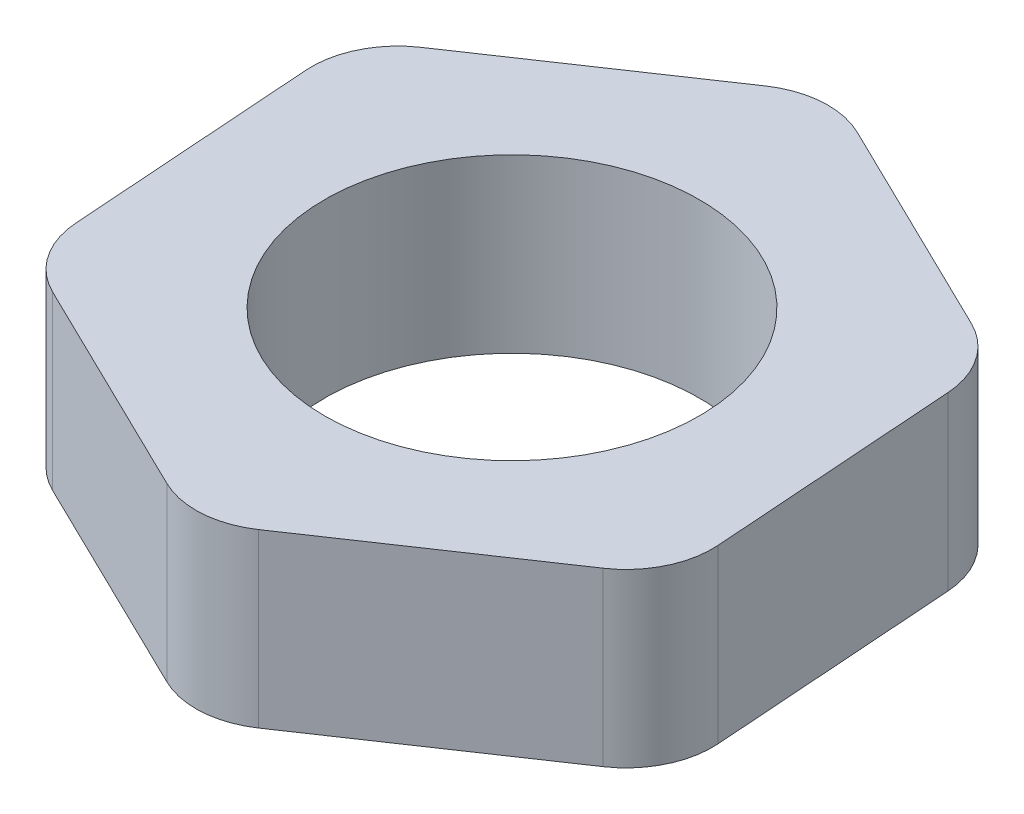
ISO-10303-21;
HEADER;
FILE_DESCRIPTION(('STEP AP214'),'2;1');
FILE_NAME('part.step','',(''),(''),'','','');
FILE_SCHEMA(('AUTOMOTIVE_DESIGN { 1 0 10303 214 1 1 1 1 }'));
ENDSEC;
DATA;
#1=APPLICATION_CONTEXT('core data for automotive mechanical design processes');
#2=APPLICATION_PROTOCOL_DEFINITION('international standard','automotive_design',2000,#1);
#3=PRODUCT_CONTEXT('',#1,'mechanical');
#4=PRODUCT('Part','Part','',(#3));
#5=PRODUCT_RELATED_PRODUCT_CATEGORY('part','',(#4));
#6=PRODUCT_DEFINITION_FORMATION('','',#4);
#7=PRODUCT_DEFINITION_CONTEXT('part definition',#1,'design');
#8=PRODUCT_DEFINITION('design','',#6,#7);
#9=PRODUCT_DEFINITION_SHAPE('','',#8);
#10=(LENGTH_UNIT() NAMED_UNIT(*) SI_UNIT(.MILLI.,.METRE.));
#11=(NAMED_UNIT(*) PLANE_ANGLE_UNIT() SI_UNIT($,.RADIAN.));
#12=(NAMED_UNIT(*) SI_UNIT($,.STERADIAN.) SOLID_ANGLE_UNIT());
#13=UNCERTAINTY_MEASURE_WITH_UNIT(LENGTH_MEASURE(1.E-05),#10,'distance_accuracy_value','');
#14=(GEOMETRIC_REPRESENTATION_CONTEXT(3) GLOBAL_UNCERTAINTY_ASSIGNED_CONTEXT((#13)) GLOBAL_UNIT_ASSIGNED_CONTEXT((#10,
#11,#12)) REPRESENTATION_CONTEXT('',''));
#15=CARTESIAN_POINT('',(0.,0.,0.));
#16=DIRECTION('',(0.,0.,1.));
#17=DIRECTION('',(1.,0.,0.));
#18=AXIS2_PLACEMENT_3D('',#15,#16,#17);
#19=CARTESIAN_POINT('',(0.,1.,0.));
#20=DIRECTION('',(0.,1.,0.));
#21=DIRECTION('',(0.,0.,1.));
#22=AXIS2_PLACEMENT_3D('',#19,#20,#21);
#23=PLANE('',#22);
#24=DIRECTION('',(-0.898893991680832,0.,-0.438166169072991));
#25=VECTOR('',#24,1.);
#26=CARTESIAN_POINT('',(1.675,1.,-1.13035761302932));
#27=LINE('',#26,#25);
#28=CARTESIAN_POINT('',(1.41551165596507,1.,-1.25684529086136));
#29=VERTEX_POINT('',#28);
#30=CARTESIAN_POINT('',(0.118069935790403,1.,-1.88928368002155));
#31=VERTEX_POINT('',#30);
#32=EDGE_CURVE('E168',#29,#31,#27,.T.);
#33=ORIENTED_EDGE('',*,*,#32,.T.);
#34=CARTESIAN_POINT('',(-0.101013148746093,1.,-1.43983668418114));
#35=DIRECTION('',(0.,1.,0.));
#36=DIRECTION('',(0.,0.,1.));
#37=AXIS2_PLACEMENT_3D('',#34,#35,#36);
#38=CIRCLE('',#37,0.5);
#39=CARTESIAN_POINT('',(-0.380704122530244,1.,-1.85429169884941));
#40=VERTEX_POINT('',#39);
#41=EDGE_CURVE('E191',#31,#40,#38,.T.);
#42=ORIENTED_EDGE('',*,*,#41,.T.);
#43=DIRECTION('',(-0.828910029336534,0.,0.559381947568303));
#44=VECTOR('',#43,1.);
#45=CARTESIAN_POINT('',(-0.14141840824453,1.,-2.01577135785359));
#46=LINE('',#45,#44);
#47=CARTESIAN_POINT('',(-1.57713269395882,1.,-1.04689340382846));
#48=VERTEX_POINT('',#47);
#49=EDGE_CURVE('E144',#40,#48,#46,.T.);
#50=ORIENTED_EDGE('',*,*,#49,.T.);
#51=CARTESIAN_POINT('',(-1.29744172017466,1.,-0.632438389160197));
#52=DIRECTION('',(0.,1.,0.));
#53=DIRECTION('',(0.,0.,1.));
#54=AXIS2_PLACEMENT_3D('',#51,#52,#53);
#55=CIRCLE('',#54,0.5);
#56=CARTESIAN_POINT('',(-1.79621577849531,1.,-0.597446407988047));
#57=VERTEX_POINT('',#56);
#58=EDGE_CURVE('E189',#48,#57,#55,.T.);
#59=ORIENTED_EDGE('',*,*,#58,.T.);
#60=DIRECTION('',(0.0699839623442985,0.,0.997548116641294));
#61=VECTOR('',#60,1.);
#62=CARTESIAN_POINT('',(-1.81641840824453,1.,-0.885413744824275));
#63=LINE('',#62,#61);
#64=CARTESIAN_POINT('',(-1.69520262974922,1.,0.842390276193091));
#65=VERTEX_POINT('',#64);
#66=EDGE_CURVE('E228',#57,#65,#63,.T.);
#67=ORIENTED_EDGE('',*,*,#66,.T.);
#68=CARTESIAN_POINT('',(-1.19642857142857,1.,0.807398295020942));
#69=DIRECTION('',(0.,1.,0.));
#70=DIRECTION('',(0.,0.,1.));
#71=AXIS2_PLACEMENT_3D('',#68,#69,#70);
#72=CIRCLE('',#71,0.5);
#73=CARTESIAN_POINT('',(-1.41551165596507,1.,1.25684529086136));
#74=VERTEX_POINT('',#73);
#75=EDGE_CURVE('E187',#65,#74,#72,.T.);
#76=ORIENTED_EDGE('',*,*,#75,.T.);
#77=DIRECTION('',(0.898893991680832,0.,0.438166169072991));
#78=VECTOR('',#77,1.);
#79=CARTESIAN_POINT('',(-1.675,1.,1.13035761302932));
#80=LINE('',#79,#78);
#81=CARTESIAN_POINT('',(-0.118069935790403,1.,1.88928368002155));
#82=VERTEX_POINT('',#81);
#83=EDGE_CURVE('E223',#74,#82,#80,.T.);
#84=ORIENTED_EDGE('',*,*,#83,.T.);
#85=CARTESIAN_POINT('',(0.101013148746093,1.,1.43983668418114));
#86=DIRECTION('',(0.,1.,0.));
#87=DIRECTION('',(0.,0.,1.));
#88=AXIS2_PLACEMENT_3D('',#85,#86,#87);
#89=CIRCLE('',#88,0.5);
#90=CARTESIAN_POINT('',(0.380704122530244,1.,1.8542916988494));
#91=VERTEX_POINT('',#90);
#92=EDGE_CURVE('E185',#82,#91,#89,.T.);
#93=ORIENTED_EDGE('',*,*,#92,.T.);
#94=DIRECTION('',(0.828910029336534,0.,-0.559381947568303));
#95=VECTOR('',#94,1.);
#96=CARTESIAN_POINT('',(0.14141840824453,1.,2.01577135785359));
#97=LINE('',#96,#95);
#98=CARTESIAN_POINT('',(1.57713269395882,1.,1.04689340382846));
#99=VERTEX_POINT('',#98);
#100=EDGE_CURVE('E213',#91,#99,#97,.T.);
#101=ORIENTED_EDGE('',*,*,#100,.T.);
#102=CARTESIAN_POINT('',(1.29744172017466,1.,0.632438389160196));
#103=DIRECTION('',(0.,1.,0.));
#104=DIRECTION('',(0.,0.,1.));
#105=AXIS2_PLACEMENT_3D('',#102,#103,#104);
#106=CIRCLE('',#105,0.5);
#107=CARTESIAN_POINT('',(1.79621577849531,1.,0.597446407988047));
#108=VERTEX_POINT('',#107);
#109=EDGE_CURVE('E55',#99,#108,#106,.T.);
#110=ORIENTED_EDGE('',*,*,#109,.T.);
#111=DIRECTION('',(-0.0699839623442984,0.,-0.997548116641294));
#112=VECTOR('',#111,1.);
#113=CARTESIAN_POINT('',(1.81641840824453,1.,0.885413744824275));
#114=LINE('',#113,#112);
#115=CARTESIAN_POINT('',(1.69520262974922,1.,-0.842390276193091));
#116=VERTEX_POINT('',#115);
#117=EDGE_CURVE('E169',#108,#116,#114,.T.);
#118=ORIENTED_EDGE('',*,*,#117,.T.);
#119=CARTESIAN_POINT('',(1.19642857142857,1.,-0.807398295020942));
#120=DIRECTION('',(0.,1.,0.));
#121=DIRECTION('',(0.,0.,1.));
#122=AXIS2_PLACEMENT_3D('',#119,#120,#121);
#123=CIRCLE('',#122,0.5);
#124=EDGE_CURVE('E182',#116,#29,#123,.T.);
#125=ORIENTED_EDGE('',*,*,#124,.T.);
#126=EDGE_LOOP('',(#33,#42,#50,#59,#67,#76,#84,#93,#101,#110,#118,#125));
#127=FACE_BOUND('',#126,.T.);
#128=CARTESIAN_POINT('',(0.,1.,0.));
#129=DIRECTION('',(0.,1.,0.));
#130=DIRECTION('',(0.,0.,1.));
#131=AXIS2_PLACEMENT_3D('',#128,#129,#130);
#132=CIRCLE('',#131,1.09);
#133=CARTESIAN_POINT('',(0.,1.,1.09));
#134=VERTEX_POINT('',#133);
#135=EDGE_CURVE('E157',#134,#134,#132,.T.);
#136=ORIENTED_EDGE('',*,*,#135,.F.);
#137=EDGE_LOOP('',(#136));
#138=FACE_BOUND('',#137,.T.);
#139=ADVANCED_FACE('F34',(#127,#138),#23,.T.);
#140=CARTESIAN_POINT('',(0.,0.,0.));
#141=DIRECTION('',(0.,1.,0.));
#142=DIRECTION('',(0.,0.,1.));
#143=AXIS2_PLACEMENT_3D('',#140,#141,#142);
#144=PLANE('',#143);
#145=DIRECTION('',(-0.828910029336534,0.,0.559381947568303));
#146=VECTOR('',#145,1.);
#147=CARTESIAN_POINT('',(-0.14141840824453,0.,-2.01577135785359));
#148=LINE('',#147,#146);
#149=CARTESIAN_POINT('',(-0.380704122530244,0.,-1.85429169884941));
#150=VERTEX_POINT('',#149);
#151=CARTESIAN_POINT('',(-1.57713269395882,0.,-1.04689340382846));
#152=VERTEX_POINT('',#151);
#153=EDGE_CURVE('E141',#150,#152,#148,.T.);
#154=ORIENTED_EDGE('',*,*,#153,.F.);
#155=CARTESIAN_POINT('',(-0.101013148746093,0.,-1.43983668418114));
#156=DIRECTION('',(0.,1.,0.));
#157=DIRECTION('',(0.,0.,1.));
#158=AXIS2_PLACEMENT_3D('',#155,#156,#157);
#159=CIRCLE('',#158,0.5);
#160=CARTESIAN_POINT('',(0.118069935790403,0.,-1.88928368002155));
#161=VERTEX_POINT('',#160);
#162=EDGE_CURVE('E124',#150,#161,#159,.F.);
#163=ORIENTED_EDGE('',*,*,#162,.T.);
#164=DIRECTION('',(-0.898893991680832,0.,-0.438166169072991));
#165=VECTOR('',#164,1.);
#166=CARTESIAN_POINT('',(1.675,0.,-1.13035761302932));
#167=LINE('',#166,#165);
#168=CARTESIAN_POINT('',(1.41551165596507,0.,-1.25684529086136));
#169=VERTEX_POINT('',#168);
#170=EDGE_CURVE('E152',#169,#161,#167,.T.);
#171=ORIENTED_EDGE('',*,*,#170,.F.);
#172=CARTESIAN_POINT('',(1.19642857142857,0.,-0.807398295020942));
#173=DIRECTION('',(0.,1.,0.));
#174=DIRECTION('',(0.,0.,1.));
#175=AXIS2_PLACEMENT_3D('',#172,#173,#174);
#176=CIRCLE('',#175,0.5);
#177=CARTESIAN_POINT('',(1.69520262974922,0.,-0.842390276193091));
#178=VERTEX_POINT('',#177);
#179=EDGE_CURVE('E145',#169,#178,#176,.F.);
#180=ORIENTED_EDGE('',*,*,#179,.T.);
#181=DIRECTION('',(-0.0699839623442984,0.,-0.997548116641294));
#182=VECTOR('',#181,1.);
#183=CARTESIAN_POINT('',(1.81641840824453,0.,0.885413744824275));
#184=LINE('',#183,#182);
#185=CARTESIAN_POINT('',(1.79621577849531,0.,0.597446407988047));
#186=VERTEX_POINT('',#185);
#187=EDGE_CURVE('E166',#186,#178,#184,.T.);
#188=ORIENTED_EDGE('',*,*,#187,.F.);
#189=CARTESIAN_POINT('',(1.29744172017466,0.,0.632438389160196));
#190=DIRECTION('',(0.,1.,0.));
#191=DIRECTION('',(0.,0.,1.));
#192=AXIS2_PLACEMENT_3D('',#189,#190,#191);
#193=CIRCLE('',#192,0.5);
#194=CARTESIAN_POINT('',(1.57713269395882,0.,1.04689340382846));
#195=VERTEX_POINT('',#194);
#196=EDGE_CURVE('E172',#186,#195,#193,.F.);
#197=ORIENTED_EDGE('',*,*,#196,.T.);
#198=DIRECTION('',(0.828910029336534,0.,-0.559381947568303));
#199=VECTOR('',#198,1.);
#200=CARTESIAN_POINT('',(0.14141840824453,0.,2.01577135785359));
#201=LINE('',#200,#199);
#202=CARTESIAN_POINT('',(0.380704122530244,0.,1.8542916988494));
#203=VERTEX_POINT('',#202);
#204=EDGE_CURVE('E163',#203,#195,#201,.T.);
#205=ORIENTED_EDGE('',*,*,#204,.F.);
#206=CARTESIAN_POINT('',(0.101013148746093,0.,1.43983668418114));
#207=DIRECTION('',(0.,1.,0.));
#208=DIRECTION('',(0.,0.,1.));
#209=AXIS2_PLACEMENT_3D('',#206,#207,#208);
#210=CIRCLE('',#209,0.5);
#211=CARTESIAN_POINT('',(-0.118069935790403,0.,1.88928368002155));
#212=VERTEX_POINT('',#211);
#213=EDGE_CURVE('E174',#203,#212,#210,.F.);
#214=ORIENTED_EDGE('',*,*,#213,.T.);
#215=DIRECTION('',(0.898893991680832,0.,0.438166169072991));
#216=VECTOR('',#215,1.);
#217=CARTESIAN_POINT('',(-1.675,0.,1.13035761302932));
#218=LINE('',#217,#216);
#219=CARTESIAN_POINT('',(-1.41551165596507,0.,1.25684529086136));
#220=VERTEX_POINT('',#219);
#221=EDGE_CURVE('E155',#220,#212,#218,.T.);
#222=ORIENTED_EDGE('',*,*,#221,.F.);
#223=CARTESIAN_POINT('',(-1.19642857142857,0.,0.807398295020942));
#224=DIRECTION('',(0.,1.,0.));
#225=DIRECTION('',(0.,0.,1.));
#226=AXIS2_PLACEMENT_3D('',#223,#224,#225);
#227=CIRCLE('',#226,0.5);
#228=CARTESIAN_POINT('',(-1.69520262974922,0.,0.842390276193091));
#229=VERTEX_POINT('',#228);
#230=EDGE_CURVE('E176',#220,#229,#227,.F.);
#231=ORIENTED_EDGE('',*,*,#230,.T.);
#232=DIRECTION('',(0.0699839623442985,0.,0.997548116641294));
#233=VECTOR('',#232,1.);
#234=CARTESIAN_POINT('',(-1.81641840824453,0.,-0.885413744824275));
#235=LINE('',#234,#233);
#236=CARTESIAN_POINT('',(-1.79621577849531,0.,-0.597446407988047));
#237=VERTEX_POINT('',#236);
#238=EDGE_CURVE('E151',#237,#229,#235,.T.);
#239=ORIENTED_EDGE('',*,*,#238,.F.);
#240=CARTESIAN_POINT('',(-1.29744172017466,0.,-0.632438389160197));
#241=DIRECTION('',(0.,1.,0.));
#242=DIRECTION('',(0.,0.,1.));
#243=AXIS2_PLACEMENT_3D('',#240,#241,#242);
#244=CIRCLE('',#243,0.5);
#245=EDGE_CURVE('E135',#237,#152,#244,.F.);
#246=ORIENTED_EDGE('',*,*,#245,.T.);
#247=EDGE_LOOP('',(#154,#163,#171,#180,#188,#197,#205,#214,#222,#231,#239,#246));
#248=FACE_BOUND('',#247,.T.);
#249=CARTESIAN_POINT('',(0.,0.,0.));
#250=DIRECTION('',(0.,1.,0.));
#251=DIRECTION('',(0.,0.,1.));
#252=AXIS2_PLACEMENT_3D('',#249,#250,#251);
#253=CIRCLE('',#252,1.09);
#254=CARTESIAN_POINT('',(0.,0.,1.09));
#255=VERTEX_POINT('',#254);
#256=EDGE_CURVE('E234',#255,#255,#253,.T.);
#257=ORIENTED_EDGE('',*,*,#256,.T.);
#258=EDGE_LOOP('',(#257));
#259=FACE_BOUND('',#258,.T.);
#260=ADVANCED_FACE('F148',(#248,#259),#144,.F.);
#261=CARTESIAN_POINT('',(1.675,1.,-1.13035761302932));
#262=DIRECTION('',(-0.438166169072991,0.,0.898893991680832));
#263=DIRECTION('',(0.898893991680832,0.,0.438166169072991));
#264=AXIS2_PLACEMENT_3D('',#261,#262,#263);
#265=PLANE('',#264);
#266=ORIENTED_EDGE('',*,*,#170,.T.);
#267=DIRECTION('',(0.,-1.,0.));
#268=VECTOR('',#267,1.);
#269=CARTESIAN_POINT('',(0.118069935790403,1.,-1.88928368002155));
#270=LINE('',#269,#268);
#271=EDGE_CURVE('E129',#161,#31,#270,.F.);
#272=ORIENTED_EDGE('',*,*,#271,.T.);
#273=ORIENTED_EDGE('',*,*,#32,.F.);
#274=DIRECTION('',(0.,-1.,0.));
#275=VECTOR('',#274,1.);
#276=CARTESIAN_POINT('',(1.41551165596507,1.,-1.25684529086136));
#277=LINE('',#276,#275);
#278=EDGE_CURVE('E134',#29,#169,#277,.T.);
#279=ORIENTED_EDGE('',*,*,#278,.T.);
#280=EDGE_LOOP('',(#266,#272,#273,#279));
#281=FACE_BOUND('',#280,.T.);
#282=ADVANCED_FACE('F248',(#281),#265,.F.);
#283=CARTESIAN_POINT('',(-0.14141840824453,1.,-2.01577135785359));
#284=DIRECTION('',(0.559381947568303,0.,0.828910029336534));
#285=DIRECTION('',(0.828910029336534,0.,-0.559381947568303));
#286=AXIS2_PLACEMENT_3D('',#283,#284,#285);
#287=PLANE('',#286);
#288=ORIENTED_EDGE('',*,*,#49,.F.);
#289=DIRECTION('',(0.,-1.,0.));
#290=VECTOR('',#289,1.);
#291=CARTESIAN_POINT('',(-0.380704122530244,1.,-1.85429169884941));
#292=LINE('',#291,#290);
#293=EDGE_CURVE('E128',#40,#150,#292,.T.);
#294=ORIENTED_EDGE('',*,*,#293,.T.);
#295=ORIENTED_EDGE('',*,*,#153,.T.);
#296=DIRECTION('',(0.,-1.,0.));
#297=VECTOR('',#296,1.);
#298=CARTESIAN_POINT('',(-1.57713269395881,1.,-1.04689340382846));
#299=LINE('',#298,#297);
#300=EDGE_CURVE('E146',#152,#48,#299,.F.);
#301=ORIENTED_EDGE('',*,*,#300,.T.);
#302=EDGE_LOOP('',(#288,#294,#295,#301));
#303=FACE_BOUND('',#302,.T.);
#304=ADVANCED_FACE('F140',(#303),#287,.F.);
#305=CARTESIAN_POINT('',(-1.81641840824453,1.,-0.885413744824275));
#306=DIRECTION('',(0.997548116641294,0.,-0.0699839623442985));
#307=DIRECTION('',(-0.0699839623442985,0.,-0.997548116641294));
#308=AXIS2_PLACEMENT_3D('',#305,#306,#307);
#309=PLANE('',#308);
#310=ORIENTED_EDGE('',*,*,#66,.F.);
#311=DIRECTION('',(0.,-1.,0.));
#312=VECTOR('',#311,1.);
#313=CARTESIAN_POINT('',(-1.79621577849531,1.,-0.597446407988047));
#314=LINE('',#313,#312);
#315=EDGE_CURVE('E195',#57,#237,#314,.T.);
#316=ORIENTED_EDGE('',*,*,#315,.T.);
#317=ORIENTED_EDGE('',*,*,#238,.T.);
#318=DIRECTION('',(0.,-1.,0.));
#319=VECTOR('',#318,1.);
#320=CARTESIAN_POINT('',(-1.69520262974922,1.,0.842390276193091));
#321=LINE('',#320,#319);
#322=EDGE_CURVE('E193',#229,#65,#321,.F.);
#323=ORIENTED_EDGE('',*,*,#322,.T.);
#324=EDGE_LOOP('',(#310,#316,#317,#323));
#325=FACE_BOUND('',#324,.T.);
#326=ADVANCED_FACE('F259',(#325),#309,.F.);
#327=CARTESIAN_POINT('',(-1.675,1.,1.13035761302932));
#328=DIRECTION('',(0.438166169072991,0.,-0.898893991680832));
#329=DIRECTION('',(-0.898893991680832,0.,-0.438166169072991));
#330=AXIS2_PLACEMENT_3D('',#327,#328,#329);
#331=PLANE('',#330);
#332=ORIENTED_EDGE('',*,*,#83,.F.);
#333=DIRECTION('',(0.,-1.,0.));
#334=VECTOR('',#333,1.);
#335=CARTESIAN_POINT('',(-1.41551165596507,1.,1.25684529086136));
#336=LINE('',#335,#334);
#337=EDGE_CURVE('E200',#74,#220,#336,.T.);
#338=ORIENTED_EDGE('',*,*,#337,.T.);
#339=ORIENTED_EDGE('',*,*,#221,.T.);
#340=DIRECTION('',(0.,-1.,0.));
#341=VECTOR('',#340,1.);
#342=CARTESIAN_POINT('',(-0.118069935790403,1.,1.88928368002155));
#343=LINE('',#342,#341);
#344=EDGE_CURVE('E198',#212,#82,#343,.F.);
#345=ORIENTED_EDGE('',*,*,#344,.T.);
#346=EDGE_LOOP('',(#332,#338,#339,#345));
#347=FACE_BOUND('',#346,.T.);
#348=ADVANCED_FACE('F256',(#347),#331,.F.);
#349=CARTESIAN_POINT('',(0.14141840824453,1.,2.01577135785359));
#350=DIRECTION('',(-0.559381947568302,0.,-0.828910029336534));
#351=DIRECTION('',(-0.828910029336534,0.,0.559381947568302));
#352=AXIS2_PLACEMENT_3D('',#349,#350,#351);
#353=PLANE('',#352);
#354=ORIENTED_EDGE('',*,*,#100,.F.);
#355=DIRECTION('',(0.,-1.,0.));
#356=VECTOR('',#355,1.);
#357=CARTESIAN_POINT('',(0.380704122530244,1.,1.8542916988494));
#358=LINE('',#357,#356);
#359=EDGE_CURVE('E205',#91,#203,#358,.T.);
#360=ORIENTED_EDGE('',*,*,#359,.T.);
#361=ORIENTED_EDGE('',*,*,#204,.T.);
#362=DIRECTION('',(0.,-1.,0.));
#363=VECTOR('',#362,1.);
#364=CARTESIAN_POINT('',(1.57713269395881,1.,1.04689340382846));
#365=LINE('',#364,#363);
#366=EDGE_CURVE('E203',#195,#99,#365,.F.);
#367=ORIENTED_EDGE('',*,*,#366,.T.);
#368=EDGE_LOOP('',(#354,#360,#361,#367));
#369=FACE_BOUND('',#368,.T.);
#370=ADVANCED_FACE('F211',(#369),#353,.F.);
#371=CARTESIAN_POINT('',(1.81641840824453,1.,0.885413744824275));
#372=DIRECTION('',(-0.997548116641294,0.,0.0699839623442984));
#373=DIRECTION('',(0.0699839623442984,0.,0.997548116641294));
#374=AXIS2_PLACEMENT_3D('',#371,#372,#373);
#375=PLANE('',#374);
#376=ORIENTED_EDGE('',*,*,#117,.F.);
#377=DIRECTION('',(0.,-1.,0.));
#378=VECTOR('',#377,1.);
#379=CARTESIAN_POINT('',(1.79621577849531,1.,0.597446407988047));
#380=LINE('',#379,#378);
#381=EDGE_CURVE('E11',#108,#186,#380,.T.);
#382=ORIENTED_EDGE('',*,*,#381,.T.);
#383=ORIENTED_EDGE('',*,*,#187,.T.);
#384=DIRECTION('',(0.,-1.,0.));
#385=VECTOR('',#384,1.);
#386=CARTESIAN_POINT('',(1.69520262974922,1.,-0.842390276193091));
#387=LINE('',#386,#385);
#388=EDGE_CURVE('E42',#178,#116,#387,.F.);
#389=ORIENTED_EDGE('',*,*,#388,.T.);
#390=EDGE_LOOP('',(#376,#382,#383,#389));
#391=FACE_BOUND('',#390,.T.);
#392=ADVANCED_FACE('F221',(#391),#375,.F.);
#393=CARTESIAN_POINT('',(0.,1.,0.));
#394=DIRECTION('',(0.,-1.,0.));
#395=DIRECTION('',(0.,0.,-1.));
#396=AXIS2_PLACEMENT_3D('',#393,#394,#395);
#397=CYLINDRICAL_SURFACE('',#396,1.09);
#398=ORIENTED_EDGE('',*,*,#135,.T.);
#399=EDGE_LOOP('',(#398));
#400=FACE_BOUND('',#399,.T.);
#401=ORIENTED_EDGE('',*,*,#256,.F.);
#402=EDGE_LOOP('',(#401));
#403=FACE_BOUND('',#402,.T.);
#404=ADVANCED_FACE('F240',(#400,#403),#397,.F.);
#405=CARTESIAN_POINT('',(-0.101013148746093,1.,-1.43983668418114));
#406=DIRECTION('',(0.,-1.,0.));
#407=DIRECTION('',(0.,0.,-1.));
#408=AXIS2_PLACEMENT_3D('',#405,#406,#407);
#409=CYLINDRICAL_SURFACE('',#408,0.5);
#410=ORIENTED_EDGE('',*,*,#41,.F.);
#411=ORIENTED_EDGE('',*,*,#271,.F.);
#412=ORIENTED_EDGE('',*,*,#162,.F.);
#413=ORIENTED_EDGE('',*,*,#293,.F.);
#414=EDGE_LOOP('',(#410,#411,#412,#413));
#415=FACE_BOUND('',#414,.T.);
#416=ADVANCED_FACE('F127',(#415),#409,.T.);
#417=CARTESIAN_POINT('',(-1.29744172017466,1.,-0.632438389160197));
#418=DIRECTION('',(0.,-1.,0.));
#419=DIRECTION('',(0.,0.,-1.));
#420=AXIS2_PLACEMENT_3D('',#417,#418,#419);
#421=CYLINDRICAL_SURFACE('',#420,0.5);
#422=ORIENTED_EDGE('',*,*,#58,.F.);
#423=ORIENTED_EDGE('',*,*,#300,.F.);
#424=ORIENTED_EDGE('',*,*,#245,.F.);
#425=ORIENTED_EDGE('',*,*,#315,.F.);
#426=EDGE_LOOP('',(#422,#423,#424,#425));
#427=FACE_BOUND('',#426,.T.);
#428=ADVANCED_FACE('F271',(#427),#421,.T.);
#429=CARTESIAN_POINT('',(-1.19642857142857,1.,0.807398295020942));
#430=DIRECTION('',(0.,-1.,0.));
#431=DIRECTION('',(0.,0.,-1.));
#432=AXIS2_PLACEMENT_3D('',#429,#430,#431);
#433=CYLINDRICAL_SURFACE('',#432,0.5);
#434=ORIENTED_EDGE('',*,*,#75,.F.);
#435=ORIENTED_EDGE('',*,*,#322,.F.);
#436=ORIENTED_EDGE('',*,*,#230,.F.);
#437=ORIENTED_EDGE('',*,*,#337,.F.);
#438=EDGE_LOOP('',(#434,#435,#436,#437));
#439=FACE_BOUND('',#438,.T.);
#440=ADVANCED_FACE('F274',(#439),#433,.T.);
#441=CARTESIAN_POINT('',(0.101013148746093,1.,1.43983668418114));
#442=DIRECTION('',(0.,-1.,0.));
#443=DIRECTION('',(0.,0.,-1.));
#444=AXIS2_PLACEMENT_3D('',#441,#442,#443);
#445=CYLINDRICAL_SURFACE('',#444,0.5);
#446=ORIENTED_EDGE('',*,*,#92,.F.);
#447=ORIENTED_EDGE('',*,*,#344,.F.);
#448=ORIENTED_EDGE('',*,*,#213,.F.);
#449=ORIENTED_EDGE('',*,*,#359,.F.);
#450=EDGE_LOOP('',(#446,#447,#448,#449));
#451=FACE_BOUND('',#450,.T.);
#452=ADVANCED_FACE('F278',(#451),#445,.T.);
#453=CARTESIAN_POINT('',(1.29744172017466,1.,0.632438389160196));
#454=DIRECTION('',(0.,-1.,0.));
#455=DIRECTION('',(0.,0.,-1.));
#456=AXIS2_PLACEMENT_3D('',#453,#454,#455);
#457=CYLINDRICAL_SURFACE('',#456,0.5);
#458=ORIENTED_EDGE('',*,*,#109,.F.);
#459=ORIENTED_EDGE('',*,*,#366,.F.);
#460=ORIENTED_EDGE('',*,*,#196,.F.);
#461=ORIENTED_EDGE('',*,*,#381,.F.);
#462=EDGE_LOOP('',(#458,#459,#460,#461));
#463=FACE_BOUND('',#462,.T.);
#464=ADVANCED_FACE('F220',(#463),#457,.T.);
#465=CARTESIAN_POINT('',(1.19642857142857,1.,-0.807398295020942));
#466=DIRECTION('',(0.,-1.,0.));
#467=DIRECTION('',(0.,0.,-1.));
#468=AXIS2_PLACEMENT_3D('',#465,#466,#467);
#469=CYLINDRICAL_SURFACE('',#468,0.5);
#470=ORIENTED_EDGE('',*,*,#124,.F.);
#471=ORIENTED_EDGE('',*,*,#388,.F.);
#472=ORIENTED_EDGE('',*,*,#179,.F.);
#473=ORIENTED_EDGE('',*,*,#278,.F.);
#474=EDGE_LOOP('',(#470,#471,#472,#473));
#475=FACE_BOUND('',#474,.T.);
#476=ADVANCED_FACE('F36',(#475),#469,.T.);
#477=CLOSED_SHELL('',(#139,#260,#282,#304,#326,#348,#370,#392,#404,#416,#428,#440,#452,#464,#476));
#478=MANIFOLD_SOLID_BREP('B2',#477);
#479=ADVANCED_BREP_SHAPE_REPRESENTATION('',(#18,#478),#14);
#480=SHAPE_DEFINITION_REPRESENTATION(#9,#479);
ENDSEC;
END-ISO-10303-21;
